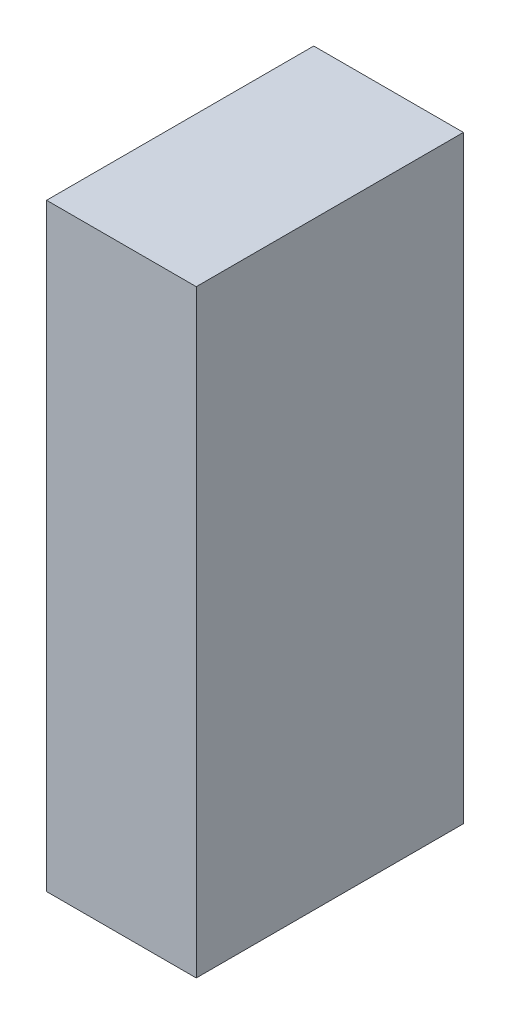
ISO-10303-21;
HEADER;
FILE_DESCRIPTION(('STEP AP214'),'2;1');
FILE_NAME('part.step','',(''),(''),'','','');
FILE_SCHEMA(('AUTOMOTIVE_DESIGN { 1 0 10303 214 1 1 1 1 }'));
ENDSEC;
DATA;
#1=APPLICATION_CONTEXT('core data for automotive mechanical design processes');
#2=APPLICATION_PROTOCOL_DEFINITION('international standard','automotive_design',2000,#1);
#3=PRODUCT_CONTEXT('',#1,'mechanical');
#4=PRODUCT('Part','Part','',(#3));
#5=PRODUCT_RELATED_PRODUCT_CATEGORY('part','',(#4));
#6=PRODUCT_DEFINITION_FORMATION('','',#4);
#7=PRODUCT_DEFINITION_CONTEXT('part definition',#1,'design');
#8=PRODUCT_DEFINITION('design','',#6,#7);
#9=PRODUCT_DEFINITION_SHAPE('','',#8);
#10=(LENGTH_UNIT() NAMED_UNIT(*) SI_UNIT(.MILLI.,.METRE.));
#11=(NAMED_UNIT(*) PLANE_ANGLE_UNIT() SI_UNIT($,.RADIAN.));
#12=(NAMED_UNIT(*) SI_UNIT($,.STERADIAN.) SOLID_ANGLE_UNIT());
#13=UNCERTAINTY_MEASURE_WITH_UNIT(LENGTH_MEASURE(1.E-05),#10,'distance_accuracy_value','');
#14=(GEOMETRIC_REPRESENTATION_CONTEXT(3) GLOBAL_UNCERTAINTY_ASSIGNED_CONTEXT((#13)) GLOBAL_UNIT_ASSIGNED_CONTEXT((#10,
#11,#12)) REPRESENTATION_CONTEXT('',''));
#15=CARTESIAN_POINT('',(0.,0.,0.));
#16=DIRECTION('',(0.,0.,1.));
#17=DIRECTION('',(1.,0.,0.));
#18=AXIS2_PLACEMENT_3D('',#15,#16,#17);
#19=CARTESIAN_POINT('',(0.,0.,150.065882890684));
#20=DIRECTION('',(1.,0.,0.));
#21=DIRECTION('',(0.,1.,0.));
#22=AXIS2_PLACEMENT_3D('',#19,#20,#21);
#23=PLANE('',#22);
#24=DIRECTION('',(0.,-1.,0.));
#25=VECTOR('',#24,1.);
#26=CARTESIAN_POINT('',(0.,0.,45.3389999999953));
#27=LINE('',#26,#25);
#28=CARTESIAN_POINT('',(0.,101.6,45.3389999999953));
#29=VERTEX_POINT('',#28);
#30=CARTESIAN_POINT('',(0.,0.,45.3389999999953));
#31=VERTEX_POINT('',#30);
#32=EDGE_CURVE('E83',#29,#31,#27,.T.);
#33=ORIENTED_EDGE('',*,*,#32,.F.);
#34=DIRECTION('',(0.,0.,-1.));
#35=VECTOR('',#34,1.);
#36=CARTESIAN_POINT('',(0.,101.6,150.065882890684));
#37=LINE('',#36,#35);
#38=CARTESIAN_POINT('',(0.,101.6,0.));
#39=VERTEX_POINT('',#38);
#40=EDGE_CURVE('E37',#29,#39,#37,.T.);
#41=ORIENTED_EDGE('',*,*,#40,.T.);
#42=DIRECTION('',(0.,-1.,0.));
#43=VECTOR('',#42,1.);
#44=CARTESIAN_POINT('',(0.,0.,0.));
#45=LINE('',#44,#43);
#46=CARTESIAN_POINT('',(0.,0.,0.));
#47=VERTEX_POINT('',#46);
#48=EDGE_CURVE('E81',#39,#47,#45,.T.);
#49=ORIENTED_EDGE('',*,*,#48,.T.);
#50=DIRECTION('',(0.,0.,-1.));
#51=VECTOR('',#50,1.);
#52=CARTESIAN_POINT('',(0.,0.,150.065882890684));
#53=LINE('',#52,#51);
#54=EDGE_CURVE('E72',#31,#47,#53,.T.);
#55=ORIENTED_EDGE('',*,*,#54,.F.);
#56=EDGE_LOOP('',(#33,#41,#49,#55));
#57=FACE_BOUND('',#56,.T.);
#58=ADVANCED_FACE('F33',(#57),#23,.F.);
#59=CARTESIAN_POINT('',(0.,0.,150.065882890684));
#60=DIRECTION('',(0.,1.,0.));
#61=DIRECTION('',(0.,0.,1.));
#62=AXIS2_PLACEMENT_3D('',#59,#60,#61);
#63=PLANE('',#62);
#64=DIRECTION('',(1.,0.,0.));
#65=VECTOR('',#64,1.);
#66=CARTESIAN_POINT('',(0.,0.,45.3389999999953));
#67=LINE('',#66,#65);
#68=CARTESIAN_POINT('',(25.4,0.,45.3389999999953));
#69=VERTEX_POINT('',#68);
#70=EDGE_CURVE('E42',#31,#69,#67,.T.);
#71=ORIENTED_EDGE('',*,*,#70,.F.);
#72=ORIENTED_EDGE('',*,*,#54,.T.);
#73=DIRECTION('',(1.,0.,0.));
#74=VECTOR('',#73,1.);
#75=CARTESIAN_POINT('',(0.,0.,0.));
#76=LINE('',#75,#74);
#77=CARTESIAN_POINT('',(25.4,0.,0.));
#78=VERTEX_POINT('',#77);
#79=EDGE_CURVE('E93',#47,#78,#76,.T.);
#80=ORIENTED_EDGE('',*,*,#79,.T.);
#81=DIRECTION('',(0.,0.,-1.));
#82=VECTOR('',#81,1.);
#83=CARTESIAN_POINT('',(25.4,0.,150.065882890684));
#84=LINE('',#83,#82);
#85=EDGE_CURVE('E102',#69,#78,#84,.T.);
#86=ORIENTED_EDGE('',*,*,#85,.F.);
#87=EDGE_LOOP('',(#71,#72,#80,#86));
#88=FACE_BOUND('',#87,.T.);
#89=ADVANCED_FACE('F106',(#88),#63,.F.);
#90=CARTESIAN_POINT('',(25.4,0.,150.065882890684));
#91=DIRECTION('',(-1.,0.,0.));
#92=DIRECTION('',(0.,-1.,0.));
#93=AXIS2_PLACEMENT_3D('',#90,#91,#92);
#94=PLANE('',#93);
#95=DIRECTION('',(0.,1.,0.));
#96=VECTOR('',#95,1.);
#97=CARTESIAN_POINT('',(25.4,0.,45.3389999999953));
#98=LINE('',#97,#96);
#99=CARTESIAN_POINT('',(25.4,101.6,45.3389999999953));
#100=VERTEX_POINT('',#99);
#101=EDGE_CURVE('E11',#69,#100,#98,.T.);
#102=ORIENTED_EDGE('',*,*,#101,.F.);
#103=ORIENTED_EDGE('',*,*,#85,.T.);
#104=DIRECTION('',(0.,1.,0.));
#105=VECTOR('',#104,1.);
#106=CARTESIAN_POINT('',(25.4,0.,0.));
#107=LINE('',#106,#105);
#108=CARTESIAN_POINT('',(25.4,101.6,0.));
#109=VERTEX_POINT('',#108);
#110=EDGE_CURVE('E103',#78,#109,#107,.T.);
#111=ORIENTED_EDGE('',*,*,#110,.T.);
#112=DIRECTION('',(0.,0.,-1.));
#113=VECTOR('',#112,1.);
#114=CARTESIAN_POINT('',(25.4,101.6,150.065882890684));
#115=LINE('',#114,#113);
#116=EDGE_CURVE('E55',#100,#109,#115,.T.);
#117=ORIENTED_EDGE('',*,*,#116,.F.);
#118=EDGE_LOOP('',(#102,#103,#111,#117));
#119=FACE_BOUND('',#118,.T.);
#120=ADVANCED_FACE('F105',(#119),#94,.F.);
#121=CARTESIAN_POINT('',(0.,101.6,150.065882890684));
#122=DIRECTION('',(0.,-1.,0.));
#123=DIRECTION('',(0.,0.,-1.));
#124=AXIS2_PLACEMENT_3D('',#121,#122,#123);
#125=PLANE('',#124);
#126=DIRECTION('',(-1.,0.,0.));
#127=VECTOR('',#126,1.);
#128=CARTESIAN_POINT('',(0.,101.6,45.3389999999953));
#129=LINE('',#128,#127);
#130=EDGE_CURVE('E90',#100,#29,#129,.T.);
#131=ORIENTED_EDGE('',*,*,#130,.F.);
#132=ORIENTED_EDGE('',*,*,#116,.T.);
#133=DIRECTION('',(-1.,0.,0.));
#134=VECTOR('',#133,1.);
#135=CARTESIAN_POINT('',(0.,101.6,0.));
#136=LINE('',#135,#134);
#137=EDGE_CURVE('E86',#109,#39,#136,.T.);
#138=ORIENTED_EDGE('',*,*,#137,.T.);
#139=ORIENTED_EDGE('',*,*,#40,.F.);
#140=EDGE_LOOP('',(#131,#132,#138,#139));
#141=FACE_BOUND('',#140,.T.);
#142=ADVANCED_FACE('F87',(#141),#125,.F.);
#143=CARTESIAN_POINT('',(0.,0.,0.));
#144=DIRECTION('',(0.,0.,-1.));
#145=DIRECTION('',(-1.,0.,0.));
#146=AXIS2_PLACEMENT_3D('',#143,#144,#145);
#147=PLANE('',#146);
#148=ORIENTED_EDGE('',*,*,#48,.F.);
#149=ORIENTED_EDGE('',*,*,#137,.F.);
#150=ORIENTED_EDGE('',*,*,#110,.F.);
#151=ORIENTED_EDGE('',*,*,#79,.F.);
#152=EDGE_LOOP('',(#148,#149,#150,#151));
#153=FACE_BOUND('',#152,.T.);
#154=ADVANCED_FACE('F92',(#153),#147,.T.);
#155=CARTESIAN_POINT('',(22.6314000000011,52.5144813517804,45.3389999999953));
#156=DIRECTION('',(0.,0.,1.));
#157=DIRECTION('',(0.,-1.,0.));
#158=AXIS2_PLACEMENT_3D('',#155,#156,#157);
#159=PLANE('',#158);
#160=ORIENTED_EDGE('',*,*,#130,.T.);
#161=ORIENTED_EDGE('',*,*,#32,.T.);
#162=ORIENTED_EDGE('',*,*,#70,.T.);
#163=ORIENTED_EDGE('',*,*,#101,.T.);
#164=EDGE_LOOP('',(#160,#161,#162,#163));
#165=FACE_BOUND('',#164,.T.);
#166=ADVANCED_FACE('F35',(#165),#159,.T.);
#167=CLOSED_SHELL('',(#58,#89,#120,#142,#154,#166));
#168=MANIFOLD_SOLID_BREP('B2',#167);
#169=ADVANCED_BREP_SHAPE_REPRESENTATION('',(#18,#168),#14);
#170=SHAPE_DEFINITION_REPRESENTATION(#9,#169);
ENDSEC;
END-ISO-10303-21;
